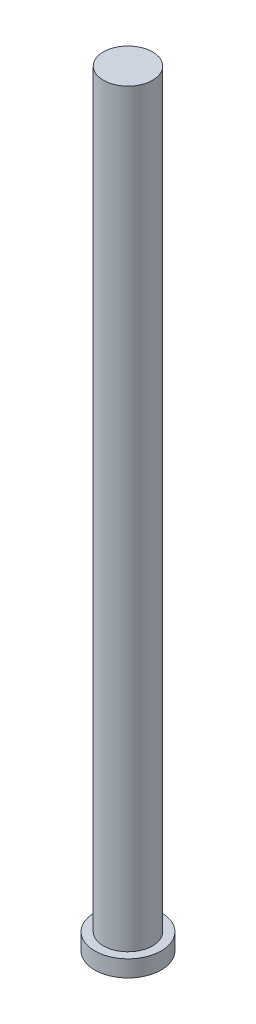
ISO-10303-21;
HEADER;
FILE_DESCRIPTION(('STEP AP214'),'2;1');
FILE_NAME('part.step','',(''),(''),'','','');
FILE_SCHEMA(('AUTOMOTIVE_DESIGN { 1 0 10303 214 1 1 1 1 }'));
ENDSEC;
DATA;
#1=APPLICATION_CONTEXT('core data for automotive mechanical design processes');
#2=APPLICATION_PROTOCOL_DEFINITION('international standard','automotive_design',2000,#1);
#3=PRODUCT_CONTEXT('',#1,'mechanical');
#4=PRODUCT('Part','Part','',(#3));
#5=PRODUCT_RELATED_PRODUCT_CATEGORY('part','',(#4));
#6=PRODUCT_DEFINITION_FORMATION('','',#4);
#7=PRODUCT_DEFINITION_CONTEXT('part definition',#1,'design');
#8=PRODUCT_DEFINITION('design','',#6,#7);
#9=PRODUCT_DEFINITION_SHAPE('','',#8);
#10=(LENGTH_UNIT() NAMED_UNIT(*) SI_UNIT(.MILLI.,.METRE.));
#11=(NAMED_UNIT(*) PLANE_ANGLE_UNIT() SI_UNIT($,.RADIAN.));
#12=(NAMED_UNIT(*) SI_UNIT($,.STERADIAN.) SOLID_ANGLE_UNIT());
#13=UNCERTAINTY_MEASURE_WITH_UNIT(LENGTH_MEASURE(1.E-05),#10,'distance_accuracy_value','');
#14=(GEOMETRIC_REPRESENTATION_CONTEXT(3) GLOBAL_UNCERTAINTY_ASSIGNED_CONTEXT((#13)) GLOBAL_UNIT_ASSIGNED_CONTEXT((#10,
#11,#12)) REPRESENTATION_CONTEXT('',''));
#15=CARTESIAN_POINT('',(0.,0.,0.));
#16=DIRECTION('',(0.,0.,1.));
#17=DIRECTION('',(1.,0.,0.));
#18=AXIS2_PLACEMENT_3D('',#15,#16,#17);
#19=CARTESIAN_POINT('',(0.,-3.175,0.));
#20=DIRECTION('',(0.,1.,0.));
#21=DIRECTION('',(0.,0.,1.));
#22=AXIS2_PLACEMENT_3D('',#19,#20,#21);
#23=CYLINDRICAL_SURFACE('',#22,6.35);
#24=CARTESIAN_POINT('',(0.,-3.175,0.));
#25=DIRECTION('',(0.,1.,0.));
#26=DIRECTION('',(0.,0.,1.));
#27=AXIS2_PLACEMENT_3D('',#24,#25,#26);
#28=CIRCLE('',#27,6.35);
#29=CARTESIAN_POINT('',(0.,-3.175,6.35));
#30=VERTEX_POINT('',#29);
#31=EDGE_CURVE('E43',#30,#30,#28,.T.);
#32=ORIENTED_EDGE('',*,*,#31,.T.);
#33=EDGE_LOOP('',(#32));
#34=FACE_BOUND('',#33,.T.);
#35=CARTESIAN_POINT('',(0.,0.,0.));
#36=DIRECTION('',(0.,1.,0.));
#37=DIRECTION('',(0.,0.,1.));
#38=AXIS2_PLACEMENT_3D('',#35,#36,#37);
#39=CIRCLE('',#38,6.35);
#40=CARTESIAN_POINT('',(0.,0.,6.35));
#41=VERTEX_POINT('',#40);
#42=EDGE_CURVE('E38',#41,#41,#39,.T.);
#43=ORIENTED_EDGE('',*,*,#42,.F.);
#44=EDGE_LOOP('',(#43));
#45=FACE_BOUND('',#44,.T.);
#46=ADVANCED_FACE('F35',(#34,#45),#23,.T.);
#47=CARTESIAN_POINT('',(0.,-3.175,0.));
#48=DIRECTION('',(0.,1.,0.));
#49=DIRECTION('',(0.,0.,1.));
#50=AXIS2_PLACEMENT_3D('',#47,#48,#49);
#51=PLANE('',#50);
#52=CARTESIAN_POINT('',(0.,-3.175,0.));
#53=DIRECTION('',(0.,-1.,0.));
#54=DIRECTION('',(0.,0.,-1.));
#55=AXIS2_PLACEMENT_3D('',#52,#53,#54);
#56=CIRCLE('',#55,3.175);
#57=CARTESIAN_POINT('',(0.,-3.175,-3.175));
#58=VERTEX_POINT('',#57);
#59=EDGE_CURVE('E59',#58,#58,#56,.T.);
#60=ORIENTED_EDGE('',*,*,#59,.F.);
#61=EDGE_LOOP('',(#60));
#62=FACE_BOUND('',#61,.T.);
#63=ORIENTED_EDGE('',*,*,#31,.F.);
#64=EDGE_LOOP('',(#63));
#65=FACE_BOUND('',#64,.T.);
#66=ADVANCED_FACE('F66',(#62,#65),#51,.F.);
#67=CARTESIAN_POINT('',(0.,0.,0.));
#68=DIRECTION('',(0.,1.,0.));
#69=DIRECTION('',(0.,0.,1.));
#70=AXIS2_PLACEMENT_3D('',#67,#68,#69);
#71=PLANE('',#70);
#72=CARTESIAN_POINT('',(0.,0.,0.));
#73=DIRECTION('',(0.,1.,0.));
#74=DIRECTION('',(0.,0.,1.));
#75=AXIS2_PLACEMENT_3D('',#72,#73,#74);
#76=CIRCLE('',#75,4.699);
#77=CARTESIAN_POINT('',(0.,0.,4.699));
#78=VERTEX_POINT('',#77);
#79=EDGE_CURVE('E10',#78,#78,#76,.T.);
#80=ORIENTED_EDGE('',*,*,#79,.F.);
#81=EDGE_LOOP('',(#80));
#82=FACE_BOUND('',#81,.T.);
#83=ORIENTED_EDGE('',*,*,#42,.T.);
#84=EDGE_LOOP('',(#83));
#85=FACE_BOUND('',#84,.T.);
#86=ADVANCED_FACE('F69',(#82,#85),#71,.T.);
#87=CARTESIAN_POINT('',(0.,143.256,0.));
#88=DIRECTION('',(0.,-1.,0.));
#89=DIRECTION('',(0.,0.,-1.));
#90=AXIS2_PLACEMENT_3D('',#87,#88,#89);
#91=CYLINDRICAL_SURFACE('',#90,4.699);
#92=CARTESIAN_POINT('',(0.,143.256,0.));
#93=DIRECTION('',(0.,1.,0.));
#94=DIRECTION('',(0.,0.,1.));
#95=AXIS2_PLACEMENT_3D('',#92,#93,#94);
#96=CIRCLE('',#95,4.699);
#97=CARTESIAN_POINT('',(0.,143.256,4.699));
#98=VERTEX_POINT('',#97);
#99=EDGE_CURVE('E51',#98,#98,#96,.T.);
#100=ORIENTED_EDGE('',*,*,#99,.F.);
#101=EDGE_LOOP('',(#100));
#102=FACE_BOUND('',#101,.T.);
#103=ORIENTED_EDGE('',*,*,#79,.T.);
#104=EDGE_LOOP('',(#103));
#105=FACE_BOUND('',#104,.T.);
#106=ADVANCED_FACE('F79',(#102,#105),#91,.T.);
#107=CARTESIAN_POINT('',(0.,143.256,0.));
#108=DIRECTION('',(0.,1.,0.));
#109=DIRECTION('',(0.,0.,1.));
#110=AXIS2_PLACEMENT_3D('',#107,#108,#109);
#111=PLANE('',#110);
#112=ORIENTED_EDGE('',*,*,#99,.T.);
#113=EDGE_LOOP('',(#112));
#114=FACE_BOUND('',#113,.T.);
#115=ADVANCED_FACE('F84',(#114),#111,.T.);
#116=CARTESIAN_POINT('',(0.,140.081,0.));
#117=DIRECTION('',(0.,1.,0.));
#118=DIRECTION('',(0.,0.,1.));
#119=AXIS2_PLACEMENT_3D('',#116,#117,#118);
#120=PLANE('',#119);
#121=CARTESIAN_POINT('',(0.,140.081,0.));
#122=DIRECTION('',(0.,-1.,0.));
#123=DIRECTION('',(0.,0.,-1.));
#124=AXIS2_PLACEMENT_3D('',#121,#122,#123);
#125=CIRCLE('',#124,3.17499999999997);
#126=CARTESIAN_POINT('',(0.,140.081,-3.17499999999997));
#127=VERTEX_POINT('',#126);
#128=EDGE_CURVE('E55',#127,#127,#125,.T.);
#129=ORIENTED_EDGE('',*,*,#128,.T.);
#130=EDGE_LOOP('',(#129));
#131=FACE_BOUND('',#130,.T.);
#132=ADVANCED_FACE('F90',(#131),#120,.F.);
#133=CARTESIAN_POINT('',(0.,-3.175,0.));
#134=DIRECTION('',(0.,-1.,0.));
#135=DIRECTION('',(0.,0.,-1.));
#136=AXIS2_PLACEMENT_3D('',#133,#134,#135);
#137=CYLINDRICAL_SURFACE('',#136,3.17499999999998);
#138=ORIENTED_EDGE('',*,*,#128,.F.);
#139=EDGE_LOOP('',(#138));
#140=FACE_BOUND('',#139,.T.);
#141=ORIENTED_EDGE('',*,*,#59,.T.);
#142=EDGE_LOOP('',(#141));
#143=FACE_BOUND('',#142,.T.);
#144=ADVANCED_FACE('F64',(#140,#143),#137,.F.);
#145=CLOSED_SHELL('',(#46,#66,#86,#106,#115,#132,#144));
#146=MANIFOLD_SOLID_BREP('B2',#145);
#147=ADVANCED_BREP_SHAPE_REPRESENTATION('',(#18,#146),#14);
#148=SHAPE_DEFINITION_REPRESENTATION(#9,#147);
ENDSEC;
END-ISO-10303-21;
